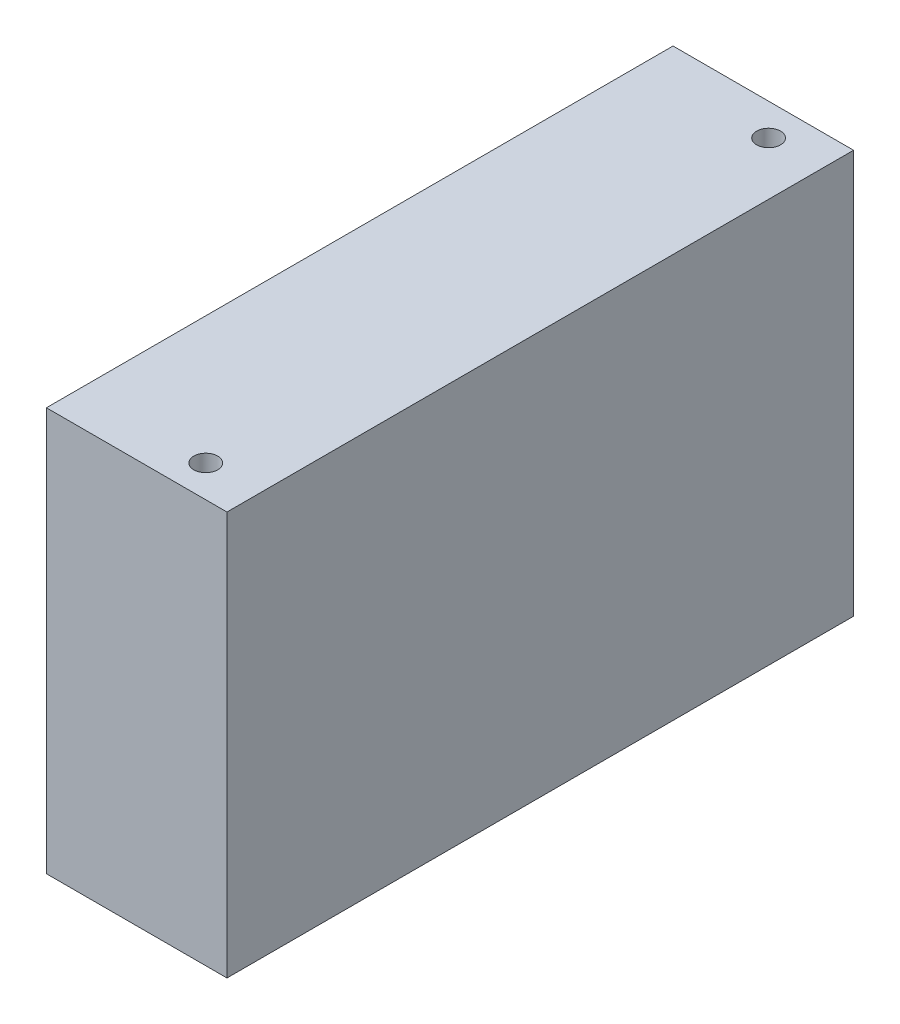
ISO-10303-21;
HEADER;
FILE_DESCRIPTION(('STEP AP214'),'2;1');
FILE_NAME('part.step','',(''),(''),'','','');
FILE_SCHEMA(('AUTOMOTIVE_DESIGN { 1 0 10303 214 1 1 1 1 }'));
ENDSEC;
DATA;
#1=APPLICATION_CONTEXT('core data for automotive mechanical design processes');
#2=APPLICATION_PROTOCOL_DEFINITION('international standard','automotive_design',2000,#1);
#3=PRODUCT_CONTEXT('',#1,'mechanical');
#4=PRODUCT('Part','Part','',(#3));
#5=PRODUCT_RELATED_PRODUCT_CATEGORY('part','',(#4));
#6=PRODUCT_DEFINITION_FORMATION('','',#4);
#7=PRODUCT_DEFINITION_CONTEXT('part definition',#1,'design');
#8=PRODUCT_DEFINITION('design','',#6,#7);
#9=PRODUCT_DEFINITION_SHAPE('','',#8);
#10=(LENGTH_UNIT() NAMED_UNIT(*) SI_UNIT(.MILLI.,.METRE.));
#11=(NAMED_UNIT(*) PLANE_ANGLE_UNIT() SI_UNIT($,.RADIAN.));
#12=(NAMED_UNIT(*) SI_UNIT($,.STERADIAN.) SOLID_ANGLE_UNIT());
#13=UNCERTAINTY_MEASURE_WITH_UNIT(LENGTH_MEASURE(1.E-05),#10,'distance_accuracy_value','');
#14=(GEOMETRIC_REPRESENTATION_CONTEXT(3) GLOBAL_UNCERTAINTY_ASSIGNED_CONTEXT((#13)) GLOBAL_UNIT_ASSIGNED_CONTEXT((#10,
#11,#12)) REPRESENTATION_CONTEXT('',''));
#15=CARTESIAN_POINT('',(0.,0.,0.));
#16=DIRECTION('',(0.,0.,1.));
#17=DIRECTION('',(1.,0.,0.));
#18=AXIS2_PLACEMENT_3D('',#15,#16,#17);
#19=CARTESIAN_POINT('',(17.,76.,59.));
#20=DIRECTION('',(-1.,0.,0.));
#21=DIRECTION('',(0.,0.,1.));
#22=AXIS2_PLACEMENT_3D('',#19,#20,#21);
#23=PLANE('',#22);
#24=DIRECTION('',(0.,0.,-1.));
#25=VECTOR('',#24,1.);
#26=CARTESIAN_POINT('',(17.,0.,59.));
#27=LINE('',#26,#25);
#28=CARTESIAN_POINT('',(17.,0.,59.));
#29=VERTEX_POINT('',#28);
#30=CARTESIAN_POINT('',(17.,0.,-59.));
#31=VERTEX_POINT('',#30);
#32=EDGE_CURVE('E102',#29,#31,#27,.T.);
#33=ORIENTED_EDGE('',*,*,#32,.T.);
#34=DIRECTION('',(0.,-1.,0.));
#35=VECTOR('',#34,1.);
#36=CARTESIAN_POINT('',(17.,76.,-59.));
#37=LINE('',#36,#35);
#38=CARTESIAN_POINT('',(17.,76.,-59.));
#39=VERTEX_POINT('',#38);
#40=EDGE_CURVE('E11',#39,#31,#37,.T.);
#41=ORIENTED_EDGE('',*,*,#40,.F.);
#42=DIRECTION('',(0.,0.,-1.));
#43=VECTOR('',#42,1.);
#44=CARTESIAN_POINT('',(17.,76.,59.));
#45=LINE('',#44,#43);
#46=CARTESIAN_POINT('',(17.,76.,59.));
#47=VERTEX_POINT('',#46);
#48=EDGE_CURVE('E90',#47,#39,#45,.T.);
#49=ORIENTED_EDGE('',*,*,#48,.F.);
#50=DIRECTION('',(0.,-1.,0.));
#51=VECTOR('',#50,1.);
#52=CARTESIAN_POINT('',(17.,76.,59.));
#53=LINE('',#52,#51);
#54=EDGE_CURVE('E98',#47,#29,#53,.T.);
#55=ORIENTED_EDGE('',*,*,#54,.T.);
#56=EDGE_LOOP('',(#33,#41,#49,#55));
#57=FACE_BOUND('',#56,.T.);
#58=ADVANCED_FACE('F39',(#57),#23,.F.);
#59=CARTESIAN_POINT('',(-17.,76.,-59.));
#60=DIRECTION('',(0.,0.,1.));
#61=DIRECTION('',(1.,0.,0.));
#62=AXIS2_PLACEMENT_3D('',#59,#60,#61);
#63=PLANE('',#62);
#64=DIRECTION('',(-1.,0.,0.));
#65=VECTOR('',#64,1.);
#66=CARTESIAN_POINT('',(-17.,0.,-59.));
#67=LINE('',#66,#65);
#68=CARTESIAN_POINT('',(-17.,0.,-59.));
#69=VERTEX_POINT('',#68);
#70=EDGE_CURVE('E94',#31,#69,#67,.T.);
#71=ORIENTED_EDGE('',*,*,#70,.T.);
#72=DIRECTION('',(0.,-1.,0.));
#73=VECTOR('',#72,1.);
#74=CARTESIAN_POINT('',(-17.,76.,-59.));
#75=LINE('',#74,#73);
#76=CARTESIAN_POINT('',(-17.,76.,-59.));
#77=VERTEX_POINT('',#76);
#78=EDGE_CURVE('E47',#77,#69,#75,.T.);
#79=ORIENTED_EDGE('',*,*,#78,.F.);
#80=DIRECTION('',(-1.,0.,0.));
#81=VECTOR('',#80,1.);
#82=CARTESIAN_POINT('',(-17.,76.,-59.));
#83=LINE('',#82,#81);
#84=EDGE_CURVE('E85',#39,#77,#83,.T.);
#85=ORIENTED_EDGE('',*,*,#84,.F.);
#86=ORIENTED_EDGE('',*,*,#40,.T.);
#87=EDGE_LOOP('',(#71,#79,#85,#86));
#88=FACE_BOUND('',#87,.T.);
#89=ADVANCED_FACE('F93',(#88),#63,.F.);
#90=CARTESIAN_POINT('',(-17.,76.,59.));
#91=DIRECTION('',(1.,0.,0.));
#92=DIRECTION('',(0.,0.,-1.));
#93=AXIS2_PLACEMENT_3D('',#90,#91,#92);
#94=PLANE('',#93);
#95=DIRECTION('',(0.,0.,1.));
#96=VECTOR('',#95,1.);
#97=CARTESIAN_POINT('',(-17.,0.,59.));
#98=LINE('',#97,#96);
#99=CARTESIAN_POINT('',(-17.,0.,59.));
#100=VERTEX_POINT('',#99);
#101=EDGE_CURVE('E72',#69,#100,#98,.T.);
#102=ORIENTED_EDGE('',*,*,#101,.T.);
#103=DIRECTION('',(0.,-1.,0.));
#104=VECTOR('',#103,1.);
#105=CARTESIAN_POINT('',(-17.,76.,59.));
#106=LINE('',#105,#104);
#107=CARTESIAN_POINT('',(-17.,76.,59.));
#108=VERTEX_POINT('',#107);
#109=EDGE_CURVE('E95',#108,#100,#106,.T.);
#110=ORIENTED_EDGE('',*,*,#109,.F.);
#111=DIRECTION('',(0.,0.,1.));
#112=VECTOR('',#111,1.);
#113=CARTESIAN_POINT('',(-17.,76.,59.));
#114=LINE('',#113,#112);
#115=EDGE_CURVE('E88',#77,#108,#114,.T.);
#116=ORIENTED_EDGE('',*,*,#115,.F.);
#117=ORIENTED_EDGE('',*,*,#78,.T.);
#118=EDGE_LOOP('',(#102,#110,#116,#117));
#119=FACE_BOUND('',#118,.T.);
#120=ADVANCED_FACE('F96',(#119),#94,.F.);
#121=CARTESIAN_POINT('',(-17.,76.,59.));
#122=DIRECTION('',(0.,0.,-1.));
#123=DIRECTION('',(-1.,0.,0.));
#124=AXIS2_PLACEMENT_3D('',#121,#122,#123);
#125=PLANE('',#124);
#126=DIRECTION('',(1.,0.,0.));
#127=VECTOR('',#126,1.);
#128=CARTESIAN_POINT('',(-17.,0.,59.));
#129=LINE('',#128,#127);
#130=EDGE_CURVE('E78',#100,#29,#129,.T.);
#131=ORIENTED_EDGE('',*,*,#130,.T.);
#132=ORIENTED_EDGE('',*,*,#54,.F.);
#133=DIRECTION('',(1.,0.,0.));
#134=VECTOR('',#133,1.);
#135=CARTESIAN_POINT('',(-17.,76.,59.));
#136=LINE('',#135,#134);
#137=EDGE_CURVE('E55',#108,#47,#136,.T.);
#138=ORIENTED_EDGE('',*,*,#137,.F.);
#139=ORIENTED_EDGE('',*,*,#109,.T.);
#140=EDGE_LOOP('',(#131,#132,#138,#139));
#141=FACE_BOUND('',#140,.T.);
#142=ADVANCED_FACE('F110',(#141),#125,.F.);
#143=CARTESIAN_POINT('',(0.,76.,0.));
#144=DIRECTION('',(0.,-1.,0.));
#145=DIRECTION('',(0.,0.,-1.));
#146=AXIS2_PLACEMENT_3D('',#143,#144,#145);
#147=PLANE('',#146);
#148=CARTESIAN_POINT('',(7.,76.,53.));
#149=DIRECTION('',(0.,-1.,0.));
#150=DIRECTION('',(0.,0.,-1.));
#151=AXIS2_PLACEMENT_3D('',#148,#149,#150);
#152=CIRCLE('',#151,2.25);
#153=CARTESIAN_POINT('',(7.,76.,50.75));
#154=VERTEX_POINT('',#153);
#155=EDGE_CURVE('E105',#154,#154,#152,.T.);
#156=ORIENTED_EDGE('',*,*,#155,.T.);
#157=EDGE_LOOP('',(#156));
#158=FACE_BOUND('',#157,.T.);
#159=CARTESIAN_POINT('',(7.,76.,-53.));
#160=DIRECTION('',(0.,-1.,0.));
#161=DIRECTION('',(0.,0.,1.));
#162=AXIS2_PLACEMENT_3D('',#159,#160,#161);
#163=CIRCLE('',#162,2.25);
#164=CARTESIAN_POINT('',(7.,76.,-50.75));
#165=VERTEX_POINT('',#164);
#166=EDGE_CURVE('E119',#165,#165,#163,.T.);
#167=ORIENTED_EDGE('',*,*,#166,.T.);
#168=EDGE_LOOP('',(#167));
#169=FACE_BOUND('',#168,.T.);
#170=ORIENTED_EDGE('',*,*,#48,.T.);
#171=ORIENTED_EDGE('',*,*,#84,.T.);
#172=ORIENTED_EDGE('',*,*,#115,.T.);
#173=ORIENTED_EDGE('',*,*,#137,.T.);
#174=EDGE_LOOP('',(#170,#171,#172,#173));
#175=FACE_BOUND('',#174,.T.);
#176=ADVANCED_FACE('F86',(#158,#169,#175),#147,.F.);
#177=CARTESIAN_POINT('',(0.,0.,0.));
#178=DIRECTION('',(0.,-1.,0.));
#179=DIRECTION('',(0.,0.,-1.));
#180=AXIS2_PLACEMENT_3D('',#177,#178,#179);
#181=PLANE('',#180);
#182=CARTESIAN_POINT('',(7.,0.,53.));
#183=DIRECTION('',(0.,-1.,0.));
#184=DIRECTION('',(0.,0.,-1.));
#185=AXIS2_PLACEMENT_3D('',#182,#183,#184);
#186=CIRCLE('',#185,2.25);
#187=CARTESIAN_POINT('',(7.,0.,50.75));
#188=VERTEX_POINT('',#187);
#189=EDGE_CURVE('E122',#188,#188,#186,.T.);
#190=ORIENTED_EDGE('',*,*,#189,.F.);
#191=EDGE_LOOP('',(#190));
#192=FACE_BOUND('',#191,.T.);
#193=CARTESIAN_POINT('',(7.,0.,-53.));
#194=DIRECTION('',(0.,-1.,0.));
#195=DIRECTION('',(0.,0.,1.));
#196=AXIS2_PLACEMENT_3D('',#193,#194,#195);
#197=CIRCLE('',#196,2.25);
#198=CARTESIAN_POINT('',(7.,0.,-50.75));
#199=VERTEX_POINT('',#198);
#200=EDGE_CURVE('E116',#199,#199,#197,.T.);
#201=ORIENTED_EDGE('',*,*,#200,.F.);
#202=EDGE_LOOP('',(#201));
#203=FACE_BOUND('',#202,.T.);
#204=ORIENTED_EDGE('',*,*,#32,.F.);
#205=ORIENTED_EDGE('',*,*,#130,.F.);
#206=ORIENTED_EDGE('',*,*,#101,.F.);
#207=ORIENTED_EDGE('',*,*,#70,.F.);
#208=EDGE_LOOP('',(#204,#205,#206,#207));
#209=FACE_BOUND('',#208,.T.);
#210=ADVANCED_FACE('F113',(#192,#203,#209),#181,.T.);
#211=CARTESIAN_POINT('',(7.,76.,-53.));
#212=DIRECTION('',(0.,-1.,0.));
#213=DIRECTION('',(0.,0.,-1.));
#214=AXIS2_PLACEMENT_3D('',#211,#212,#213);
#215=CYLINDRICAL_SURFACE('',#214,2.25);
#216=ORIENTED_EDGE('',*,*,#166,.F.);
#217=EDGE_LOOP('',(#216));
#218=FACE_BOUND('',#217,.T.);
#219=ORIENTED_EDGE('',*,*,#200,.T.);
#220=EDGE_LOOP('',(#219));
#221=FACE_BOUND('',#220,.T.);
#222=ADVANCED_FACE('F133',(#218,#221),#215,.F.);
#223=CARTESIAN_POINT('',(7.,76.,53.));
#224=DIRECTION('',(0.,-1.,0.));
#225=DIRECTION('',(0.,0.,-1.));
#226=AXIS2_PLACEMENT_3D('',#223,#224,#225);
#227=CYLINDRICAL_SURFACE('',#226,2.25);
#228=ORIENTED_EDGE('',*,*,#155,.F.);
#229=EDGE_LOOP('',(#228));
#230=FACE_BOUND('',#229,.T.);
#231=ORIENTED_EDGE('',*,*,#189,.T.);
#232=EDGE_LOOP('',(#231));
#233=FACE_BOUND('',#232,.T.);
#234=ADVANCED_FACE('F130',(#230,#233),#227,.F.);
#235=CLOSED_SHELL('',(#58,#89,#120,#142,#176,#210,#222,#234));
#236=MANIFOLD_SOLID_BREP('B2',#235);
#237=ADVANCED_BREP_SHAPE_REPRESENTATION('',(#18,#236),#14);
#238=SHAPE_DEFINITION_REPRESENTATION(#9,#237);
ENDSEC;
END-ISO-10303-21;
